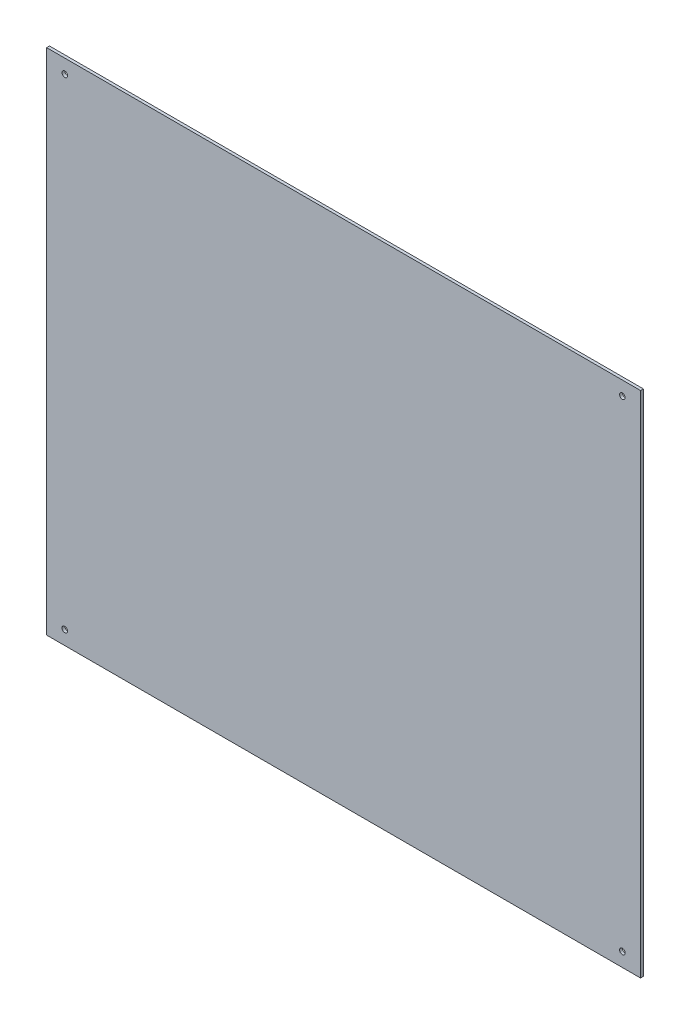
ISO-10303-21;
HEADER;
FILE_DESCRIPTION(('STEP AP214'),'2;1');
FILE_NAME('part.step','',(''),(''),'','','');
FILE_SCHEMA(('AUTOMOTIVE_DESIGN { 1 0 10303 214 1 1 1 1 }'));
ENDSEC;
DATA;
#1=APPLICATION_CONTEXT('core data for automotive mechanical design processes');
#2=APPLICATION_PROTOCOL_DEFINITION('international standard','automotive_design',2000,#1);
#3=PRODUCT_CONTEXT('',#1,'mechanical');
#4=PRODUCT('Part','Part','',(#3));
#5=PRODUCT_RELATED_PRODUCT_CATEGORY('part','',(#4));
#6=PRODUCT_DEFINITION_FORMATION('','',#4);
#7=PRODUCT_DEFINITION_CONTEXT('part definition',#1,'design');
#8=PRODUCT_DEFINITION('design','',#6,#7);
#9=PRODUCT_DEFINITION_SHAPE('','',#8);
#10=(LENGTH_UNIT() NAMED_UNIT(*) SI_UNIT(.MILLI.,.METRE.));
#11=(NAMED_UNIT(*) PLANE_ANGLE_UNIT() SI_UNIT($,.RADIAN.));
#12=(NAMED_UNIT(*) SI_UNIT($,.STERADIAN.) SOLID_ANGLE_UNIT());
#13=UNCERTAINTY_MEASURE_WITH_UNIT(LENGTH_MEASURE(1.E-05),#10,'distance_accuracy_value','');
#14=(GEOMETRIC_REPRESENTATION_CONTEXT(3) GLOBAL_UNCERTAINTY_ASSIGNED_CONTEXT((#13)) GLOBAL_UNIT_ASSIGNED_CONTEXT((#10,
#11,#12)) REPRESENTATION_CONTEXT('',''));
#15=CARTESIAN_POINT('',(0.,0.,0.));
#16=DIRECTION('',(0.,0.,1.));
#17=DIRECTION('',(1.,0.,0.));
#18=AXIS2_PLACEMENT_3D('',#15,#16,#17);
#19=CARTESIAN_POINT('',(0.,0.,2.032));
#20=DIRECTION('',(0.,0.,-1.));
#21=DIRECTION('',(-1.,0.,0.));
#22=AXIS2_PLACEMENT_3D('',#19,#20,#21);
#23=PLANE('',#22);
#24=DIRECTION('',(0.,-1.,0.));
#25=VECTOR('',#24,1.);
#26=CARTESIAN_POINT('',(-213.,-182.5,2.032));
#27=LINE('',#26,#25);
#28=CARTESIAN_POINT('',(-213.,182.5,2.032));
#29=VERTEX_POINT('',#28);
#30=CARTESIAN_POINT('',(-213.,-182.5,2.032));
#31=VERTEX_POINT('',#30);
#32=EDGE_CURVE('E85',#29,#31,#27,.T.);
#33=ORIENTED_EDGE('',*,*,#32,.T.);
#34=DIRECTION('',(1.,0.,0.));
#35=VECTOR('',#34,1.);
#36=CARTESIAN_POINT('',(213.,-182.5,2.032));
#37=LINE('',#36,#35);
#38=CARTESIAN_POINT('',(213.,-182.5,2.032));
#39=VERTEX_POINT('',#38);
#40=EDGE_CURVE('E80',#31,#39,#37,.T.);
#41=ORIENTED_EDGE('',*,*,#40,.T.);
#42=DIRECTION('',(0.,1.,0.));
#43=VECTOR('',#42,1.);
#44=CARTESIAN_POINT('',(213.,182.5,2.032));
#45=LINE('',#44,#43);
#46=CARTESIAN_POINT('',(213.,182.5,2.032));
#47=VERTEX_POINT('',#46);
#48=EDGE_CURVE('E83',#39,#47,#45,.T.);
#49=ORIENTED_EDGE('',*,*,#48,.T.);
#50=DIRECTION('',(-1.,0.,0.));
#51=VECTOR('',#50,1.);
#52=CARTESIAN_POINT('',(-213.,182.5,2.032));
#53=LINE('',#52,#51);
#54=EDGE_CURVE('E50',#47,#29,#53,.T.);
#55=ORIENTED_EDGE('',*,*,#54,.T.);
#56=EDGE_LOOP('',(#33,#41,#49,#55));
#57=FACE_BOUND('',#56,.T.);
#58=CARTESIAN_POINT('',(200.,172.5,2.032));
#59=DIRECTION('',(0.,0.,1.));
#60=DIRECTION('',(1.,0.,0.));
#61=AXIS2_PLACEMENT_3D('',#58,#59,#60);
#62=CIRCLE('',#61,2.);
#63=CARTESIAN_POINT('',(202.,172.5,2.032));
#64=VERTEX_POINT('',#63);
#65=EDGE_CURVE('E100',#64,#64,#62,.T.);
#66=ORIENTED_EDGE('',*,*,#65,.F.);
#67=EDGE_LOOP('',(#66));
#68=FACE_BOUND('',#67,.T.);
#69=CARTESIAN_POINT('',(-200.,-172.5,2.032));
#70=DIRECTION('',(0.,0.,1.));
#71=DIRECTION('',(1.,0.,0.));
#72=AXIS2_PLACEMENT_3D('',#69,#70,#71);
#73=CIRCLE('',#72,2.);
#74=CARTESIAN_POINT('',(-198.,-172.5,2.032));
#75=VERTEX_POINT('',#74);
#76=EDGE_CURVE('E115',#75,#75,#73,.T.);
#77=ORIENTED_EDGE('',*,*,#76,.F.);
#78=EDGE_LOOP('',(#77));
#79=FACE_BOUND('',#78,.T.);
#80=CARTESIAN_POINT('',(200.,-172.5,2.032));
#81=DIRECTION('',(0.,0.,1.));
#82=DIRECTION('',(1.,0.,0.));
#83=AXIS2_PLACEMENT_3D('',#80,#81,#82);
#84=CIRCLE('',#83,2.);
#85=CARTESIAN_POINT('',(202.,-172.5,2.032));
#86=VERTEX_POINT('',#85);
#87=EDGE_CURVE('E121',#86,#86,#84,.T.);
#88=ORIENTED_EDGE('',*,*,#87,.F.);
#89=EDGE_LOOP('',(#88));
#90=FACE_BOUND('',#89,.T.);
#91=CARTESIAN_POINT('',(-200.,172.5,2.032));
#92=DIRECTION('',(0.,0.,1.));
#93=DIRECTION('',(1.,0.,0.));
#94=AXIS2_PLACEMENT_3D('',#91,#92,#93);
#95=CIRCLE('',#94,2.);
#96=CARTESIAN_POINT('',(-198.,172.5,2.032));
#97=VERTEX_POINT('',#96);
#98=EDGE_CURVE('E127',#97,#97,#95,.T.);
#99=ORIENTED_EDGE('',*,*,#98,.F.);
#100=EDGE_LOOP('',(#99));
#101=FACE_BOUND('',#100,.T.);
#102=ADVANCED_FACE('F33',(#57,#68,#79,#90,#101),#23,.F.);
#103=CARTESIAN_POINT('',(0.,0.,0.));
#104=DIRECTION('',(0.,0.,-1.));
#105=DIRECTION('',(-1.,0.,0.));
#106=AXIS2_PLACEMENT_3D('',#103,#104,#105);
#107=PLANE('',#106);
#108=CARTESIAN_POINT('',(200.,-172.5,0.));
#109=DIRECTION('',(0.,0.,1.));
#110=DIRECTION('',(1.,0.,0.));
#111=AXIS2_PLACEMENT_3D('',#108,#109,#110);
#112=CIRCLE('',#111,2.);
#113=CARTESIAN_POINT('',(202.,-172.5,0.));
#114=VERTEX_POINT('',#113);
#115=EDGE_CURVE('E124',#114,#114,#112,.T.);
#116=ORIENTED_EDGE('',*,*,#115,.T.);
#117=EDGE_LOOP('',(#116));
#118=FACE_BOUND('',#117,.T.);
#119=CARTESIAN_POINT('',(200.,172.5,0.));
#120=DIRECTION('',(0.,0.,1.));
#121=DIRECTION('',(1.,0.,0.));
#122=AXIS2_PLACEMENT_3D('',#119,#120,#121);
#123=CIRCLE('',#122,2.);
#124=CARTESIAN_POINT('',(202.,172.5,0.));
#125=VERTEX_POINT('',#124);
#126=EDGE_CURVE('E112',#125,#125,#123,.T.);
#127=ORIENTED_EDGE('',*,*,#126,.T.);
#128=EDGE_LOOP('',(#127));
#129=FACE_BOUND('',#128,.T.);
#130=DIRECTION('',(0.,-1.,0.));
#131=VECTOR('',#130,1.);
#132=CARTESIAN_POINT('',(-213.,-182.5,0.));
#133=LINE('',#132,#131);
#134=CARTESIAN_POINT('',(-213.,182.5,0.));
#135=VERTEX_POINT('',#134);
#136=CARTESIAN_POINT('',(-213.,-182.5,0.));
#137=VERTEX_POINT('',#136);
#138=EDGE_CURVE('E97',#135,#137,#133,.T.);
#139=ORIENTED_EDGE('',*,*,#138,.F.);
#140=DIRECTION('',(-1.,0.,0.));
#141=VECTOR('',#140,1.);
#142=CARTESIAN_POINT('',(-213.,182.5,0.));
#143=LINE('',#142,#141);
#144=CARTESIAN_POINT('',(213.,182.5,0.));
#145=VERTEX_POINT('',#144);
#146=EDGE_CURVE('E73',#145,#135,#143,.T.);
#147=ORIENTED_EDGE('',*,*,#146,.F.);
#148=DIRECTION('',(0.,1.,0.));
#149=VECTOR('',#148,1.);
#150=CARTESIAN_POINT('',(213.,182.5,0.));
#151=LINE('',#150,#149);
#152=CARTESIAN_POINT('',(213.,-182.5,0.));
#153=VERTEX_POINT('',#152);
#154=EDGE_CURVE('E67',#153,#145,#151,.T.);
#155=ORIENTED_EDGE('',*,*,#154,.F.);
#156=DIRECTION('',(1.,0.,0.));
#157=VECTOR('',#156,1.);
#158=CARTESIAN_POINT('',(213.,-182.5,0.));
#159=LINE('',#158,#157);
#160=EDGE_CURVE('E89',#137,#153,#159,.T.);
#161=ORIENTED_EDGE('',*,*,#160,.F.);
#162=EDGE_LOOP('',(#139,#147,#155,#161));
#163=FACE_BOUND('',#162,.T.);
#164=CARTESIAN_POINT('',(-200.,-172.5,0.));
#165=DIRECTION('',(0.,0.,1.));
#166=DIRECTION('',(1.,0.,0.));
#167=AXIS2_PLACEMENT_3D('',#164,#165,#166);
#168=CIRCLE('',#167,2.);
#169=CARTESIAN_POINT('',(-198.,-172.5,0.));
#170=VERTEX_POINT('',#169);
#171=EDGE_CURVE('E118',#170,#170,#168,.T.);
#172=ORIENTED_EDGE('',*,*,#171,.T.);
#173=EDGE_LOOP('',(#172));
#174=FACE_BOUND('',#173,.T.);
#175=CARTESIAN_POINT('',(-200.,172.5,0.));
#176=DIRECTION('',(0.,0.,1.));
#177=DIRECTION('',(1.,0.,0.));
#178=AXIS2_PLACEMENT_3D('',#175,#176,#177);
#179=CIRCLE('',#178,2.);
#180=CARTESIAN_POINT('',(-198.,172.5,0.));
#181=VERTEX_POINT('',#180);
#182=EDGE_CURVE('E130',#181,#181,#179,.T.);
#183=ORIENTED_EDGE('',*,*,#182,.T.);
#184=EDGE_LOOP('',(#183));
#185=FACE_BOUND('',#184,.T.);
#186=ADVANCED_FACE('F108',(#118,#129,#163,#174,#185),#107,.T.);
#187=CARTESIAN_POINT('',(-213.,-182.5,2.032));
#188=DIRECTION('',(1.,0.,0.));
#189=DIRECTION('',(0.,0.,-1.));
#190=AXIS2_PLACEMENT_3D('',#187,#188,#189);
#191=PLANE('',#190);
#192=ORIENTED_EDGE('',*,*,#138,.T.);
#193=DIRECTION('',(0.,0.,-1.));
#194=VECTOR('',#193,1.);
#195=CARTESIAN_POINT('',(-213.,-182.5,2.032));
#196=LINE('',#195,#194);
#197=EDGE_CURVE('E11',#31,#137,#196,.T.);
#198=ORIENTED_EDGE('',*,*,#197,.F.);
#199=ORIENTED_EDGE('',*,*,#32,.F.);
#200=DIRECTION('',(0.,0.,-1.));
#201=VECTOR('',#200,1.);
#202=CARTESIAN_POINT('',(-213.,182.5,2.032));
#203=LINE('',#202,#201);
#204=EDGE_CURVE('E93',#29,#135,#203,.T.);
#205=ORIENTED_EDGE('',*,*,#204,.T.);
#206=EDGE_LOOP('',(#192,#198,#199,#205));
#207=FACE_BOUND('',#206,.T.);
#208=ADVANCED_FACE('F35',(#207),#191,.F.);
#209=CARTESIAN_POINT('',(213.,-182.5,2.032));
#210=DIRECTION('',(0.,1.,0.));
#211=DIRECTION('',(0.,0.,1.));
#212=AXIS2_PLACEMENT_3D('',#209,#210,#211);
#213=PLANE('',#212);
#214=ORIENTED_EDGE('',*,*,#160,.T.);
#215=DIRECTION('',(0.,0.,-1.));
#216=VECTOR('',#215,1.);
#217=CARTESIAN_POINT('',(213.,-182.5,2.032));
#218=LINE('',#217,#216);
#219=EDGE_CURVE('E42',#39,#153,#218,.T.);
#220=ORIENTED_EDGE('',*,*,#219,.F.);
#221=ORIENTED_EDGE('',*,*,#40,.F.);
#222=ORIENTED_EDGE('',*,*,#197,.T.);
#223=EDGE_LOOP('',(#214,#220,#221,#222));
#224=FACE_BOUND('',#223,.T.);
#225=ADVANCED_FACE('F88',(#224),#213,.F.);
#226=CARTESIAN_POINT('',(213.,182.5,2.032));
#227=DIRECTION('',(-1.,0.,0.));
#228=DIRECTION('',(0.,0.,1.));
#229=AXIS2_PLACEMENT_3D('',#226,#227,#228);
#230=PLANE('',#229);
#231=ORIENTED_EDGE('',*,*,#154,.T.);
#232=DIRECTION('',(0.,0.,-1.));
#233=VECTOR('',#232,1.);
#234=CARTESIAN_POINT('',(213.,182.5,2.032));
#235=LINE('',#234,#233);
#236=EDGE_CURVE('E90',#47,#145,#235,.T.);
#237=ORIENTED_EDGE('',*,*,#236,.F.);
#238=ORIENTED_EDGE('',*,*,#48,.F.);
#239=ORIENTED_EDGE('',*,*,#219,.T.);
#240=EDGE_LOOP('',(#231,#237,#238,#239));
#241=FACE_BOUND('',#240,.T.);
#242=ADVANCED_FACE('F91',(#241),#230,.F.);
#243=CARTESIAN_POINT('',(-213.,182.5,2.032));
#244=DIRECTION('',(0.,-1.,0.));
#245=DIRECTION('',(0.,0.,-1.));
#246=AXIS2_PLACEMENT_3D('',#243,#244,#245);
#247=PLANE('',#246);
#248=ORIENTED_EDGE('',*,*,#146,.T.);
#249=ORIENTED_EDGE('',*,*,#204,.F.);
#250=ORIENTED_EDGE('',*,*,#54,.F.);
#251=ORIENTED_EDGE('',*,*,#236,.T.);
#252=EDGE_LOOP('',(#248,#249,#250,#251));
#253=FACE_BOUND('',#252,.T.);
#254=ADVANCED_FACE('F105',(#253),#247,.F.);
#255=CARTESIAN_POINT('',(200.,172.5,2.032));
#256=DIRECTION('',(0.,0.,-1.));
#257=DIRECTION('',(-1.,0.,0.));
#258=AXIS2_PLACEMENT_3D('',#255,#256,#257);
#259=CYLINDRICAL_SURFACE('',#258,2.);
#260=ORIENTED_EDGE('',*,*,#65,.T.);
#261=EDGE_LOOP('',(#260));
#262=FACE_BOUND('',#261,.T.);
#263=ORIENTED_EDGE('',*,*,#126,.F.);
#264=EDGE_LOOP('',(#263));
#265=FACE_BOUND('',#264,.T.);
#266=ADVANCED_FACE('F147',(#262,#265),#259,.F.);
#267=CARTESIAN_POINT('',(-200.,-172.5,2.032));
#268=DIRECTION('',(0.,0.,-1.));
#269=DIRECTION('',(-1.,0.,0.));
#270=AXIS2_PLACEMENT_3D('',#267,#268,#269);
#271=CYLINDRICAL_SURFACE('',#270,2.);
#272=ORIENTED_EDGE('',*,*,#76,.T.);
#273=EDGE_LOOP('',(#272));
#274=FACE_BOUND('',#273,.T.);
#275=ORIENTED_EDGE('',*,*,#171,.F.);
#276=EDGE_LOOP('',(#275));
#277=FACE_BOUND('',#276,.T.);
#278=ADVANCED_FACE('F193',(#274,#277),#271,.F.);
#279=CARTESIAN_POINT('',(200.,-172.5,2.032));
#280=DIRECTION('',(0.,0.,-1.));
#281=DIRECTION('',(-1.,0.,0.));
#282=AXIS2_PLACEMENT_3D('',#279,#280,#281);
#283=CYLINDRICAL_SURFACE('',#282,2.);
#284=ORIENTED_EDGE('',*,*,#87,.T.);
#285=EDGE_LOOP('',(#284));
#286=FACE_BOUND('',#285,.T.);
#287=ORIENTED_EDGE('',*,*,#115,.F.);
#288=EDGE_LOOP('',(#287));
#289=FACE_BOUND('',#288,.T.);
#290=ADVANCED_FACE('F201',(#286,#289),#283,.F.);
#291=CARTESIAN_POINT('',(-200.,172.5,2.032));
#292=DIRECTION('',(0.,0.,-1.));
#293=DIRECTION('',(-1.,0.,0.));
#294=AXIS2_PLACEMENT_3D('',#291,#292,#293);
#295=CYLINDRICAL_SURFACE('',#294,2.);
#296=ORIENTED_EDGE('',*,*,#98,.T.);
#297=EDGE_LOOP('',(#296));
#298=FACE_BOUND('',#297,.T.);
#299=ORIENTED_EDGE('',*,*,#182,.F.);
#300=EDGE_LOOP('',(#299));
#301=FACE_BOUND('',#300,.T.);
#302=ADVANCED_FACE('F136',(#298,#301),#295,.F.);
#303=CLOSED_SHELL('',(#102,#186,#208,#225,#242,#254,#266,#278,#290,#302));
#304=MANIFOLD_SOLID_BREP('B2',#303);
#305=ADVANCED_BREP_SHAPE_REPRESENTATION('',(#18,#304),#14);
#306=SHAPE_DEFINITION_REPRESENTATION(#9,#305);
ENDSEC;
END-ISO-10303-21;
